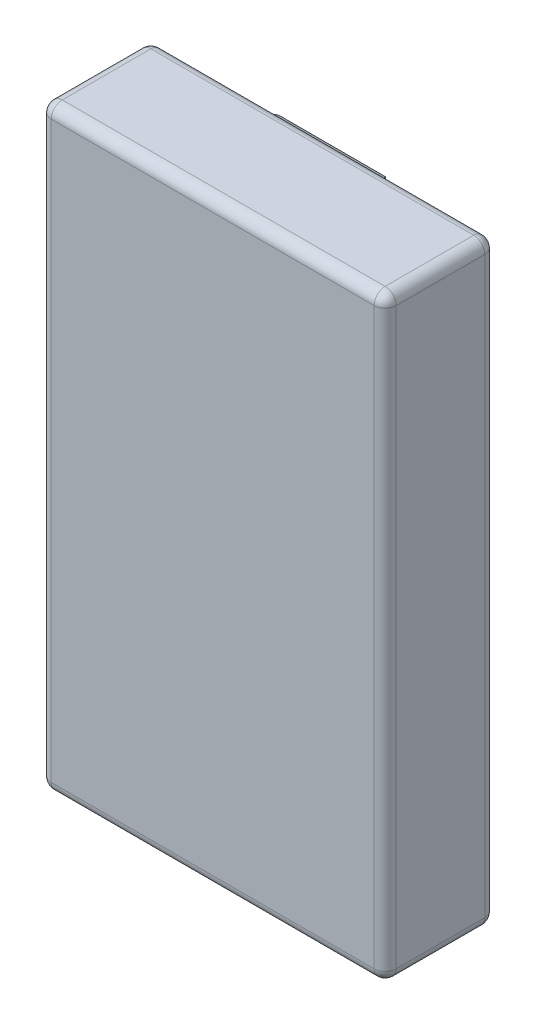
ISO-10303-21;
HEADER;
FILE_DESCRIPTION(('STEP AP214'),'2;1');
FILE_NAME('part.step','',(''),(''),'','','');
FILE_SCHEMA(('AUTOMOTIVE_DESIGN { 1 0 10303 214 1 1 1 1 }'));
ENDSEC;
DATA;
#1=APPLICATION_CONTEXT('core data for automotive mechanical design processes');
#2=APPLICATION_PROTOCOL_DEFINITION('international standard','automotive_design',2000,#1);
#3=PRODUCT_CONTEXT('',#1,'mechanical');
#4=PRODUCT('Part','Part','',(#3));
#5=PRODUCT_RELATED_PRODUCT_CATEGORY('part','',(#4));
#6=PRODUCT_DEFINITION_FORMATION('','',#4);
#7=PRODUCT_DEFINITION_CONTEXT('part definition',#1,'design');
#8=PRODUCT_DEFINITION('design','',#6,#7);
#9=PRODUCT_DEFINITION_SHAPE('','',#8);
#10=(LENGTH_UNIT() NAMED_UNIT(*) SI_UNIT(.MILLI.,.METRE.));
#11=(NAMED_UNIT(*) PLANE_ANGLE_UNIT() SI_UNIT($,.RADIAN.));
#12=(NAMED_UNIT(*) SI_UNIT($,.STERADIAN.) SOLID_ANGLE_UNIT());
#13=UNCERTAINTY_MEASURE_WITH_UNIT(LENGTH_MEASURE(1.E-05),#10,'distance_accuracy_value','');
#14=(GEOMETRIC_REPRESENTATION_CONTEXT(3) GLOBAL_UNCERTAINTY_ASSIGNED_CONTEXT((#13)) GLOBAL_UNIT_ASSIGNED_CONTEXT((#10,
#11,#12)) REPRESENTATION_CONTEXT('',''));
#15=CARTESIAN_POINT('',(0.,0.,0.));
#16=DIRECTION('',(0.,0.,1.));
#17=DIRECTION('',(1.,0.,0.));
#18=AXIS2_PLACEMENT_3D('',#15,#16,#17);
#19=CARTESIAN_POINT('',(15.5863692766047,-16.6557198149287,10.));
#20=DIRECTION('',(-1.,0.,0.));
#21=DIRECTION('',(0.,0.,1.));
#22=AXIS2_PLACEMENT_3D('',#19,#20,#21);
#23=PLANE('',#22);
#24=DIRECTION('',(0.,1.,0.));
#25=VECTOR('',#24,1.);
#26=CARTESIAN_POINT('',(15.5863692766047,-70.5519128041487,9.));
#27=LINE('',#26,#25);
#28=CARTESIAN_POINT('',(15.5863692766047,-17.6557198149287,9.));
#29=VERTEX_POINT('',#28);
#30=CARTESIAN_POINT('',(15.5863692766047,-69.5519128041487,9.));
#31=VERTEX_POINT('',#30);
#32=EDGE_CURVE('E223',#29,#31,#27,.F.);
#33=ORIENTED_EDGE('',*,*,#32,.T.);
#34=DIRECTION('',(0.,0.,-1.));
#35=VECTOR('',#34,1.);
#36=CARTESIAN_POINT('',(15.5863692766047,-69.5519128041487,10.));
#37=LINE('',#36,#35);
#38=CARTESIAN_POINT('',(15.5863692766047,-69.5519128041487,0.999999999999999));
#39=VERTEX_POINT('',#38);
#40=EDGE_CURVE('E225',#31,#39,#37,.T.);
#41=ORIENTED_EDGE('',*,*,#40,.T.);
#42=DIRECTION('',(0.,1.,0.));
#43=VECTOR('',#42,1.);
#44=CARTESIAN_POINT('',(15.5863692766047,-16.6557198149287,0.999999999999999));
#45=LINE('',#44,#43);
#46=CARTESIAN_POINT('',(15.5863692766047,-17.6557198149287,0.999999999999999));
#47=VERTEX_POINT('',#46);
#48=EDGE_CURVE('E213',#39,#47,#45,.T.);
#49=ORIENTED_EDGE('',*,*,#48,.T.);
#50=DIRECTION('',(0.,0.,-1.));
#51=VECTOR('',#50,1.);
#52=CARTESIAN_POINT('',(15.5863692766047,-17.6557198149287,10.));
#53=LINE('',#52,#51);
#54=EDGE_CURVE('E221',#47,#29,#53,.F.);
#55=ORIENTED_EDGE('',*,*,#54,.T.);
#56=EDGE_LOOP('',(#33,#41,#49,#55));
#57=FACE_BOUND('',#56,.T.);
#58=ADVANCED_FACE('F35',(#57),#23,.F.);
#59=CARTESIAN_POINT('',(-15.5863692766047,-16.6557198149287,10.));
#60=DIRECTION('',(0.,-1.,0.));
#61=DIRECTION('',(0.,0.,-1.));
#62=AXIS2_PLACEMENT_3D('',#59,#60,#61);
#63=PLANE('',#62);
#64=DIRECTION('',(-1.,0.,0.));
#65=VECTOR('',#64,1.);
#66=CARTESIAN_POINT('',(15.5863692766047,-16.6557198149287,9.));
#67=LINE('',#66,#65);
#68=CARTESIAN_POINT('',(-14.5863692766047,-16.6557198149287,9.));
#69=VERTEX_POINT('',#68);
#70=CARTESIAN_POINT('',(14.5863692766047,-16.6557198149287,9.));
#71=VERTEX_POINT('',#70);
#72=EDGE_CURVE('E250',#69,#71,#67,.F.);
#73=ORIENTED_EDGE('',*,*,#72,.T.);
#74=DIRECTION('',(0.,0.,-1.));
#75=VECTOR('',#74,1.);
#76=CARTESIAN_POINT('',(14.5863692766047,-16.6557198149287,10.));
#77=LINE('',#76,#75);
#78=CARTESIAN_POINT('',(14.5863692766047,-16.6557198149287,0.999999999999999));
#79=VERTEX_POINT('',#78);
#80=EDGE_CURVE('E252',#71,#79,#77,.T.);
#81=ORIENTED_EDGE('',*,*,#80,.T.);
#82=DIRECTION('',(-1.,0.,0.));
#83=VECTOR('',#82,1.);
#84=CARTESIAN_POINT('',(-15.5863692766047,-16.6557198149287,0.999999999999999));
#85=LINE('',#84,#83);
#86=CARTESIAN_POINT('',(-14.5863692766047,-16.6557198149287,0.999999999999999));
#87=VERTEX_POINT('',#86);
#88=EDGE_CURVE('E248',#79,#87,#85,.T.);
#89=ORIENTED_EDGE('',*,*,#88,.T.);
#90=DIRECTION('',(0.,0.,-1.));
#91=VECTOR('',#90,1.);
#92=CARTESIAN_POINT('',(-14.5863692766047,-16.6557198149287,10.));
#93=LINE('',#92,#91);
#94=EDGE_CURVE('E246',#87,#69,#93,.F.);
#95=ORIENTED_EDGE('',*,*,#94,.T.);
#96=EDGE_LOOP('',(#73,#81,#89,#95));
#97=FACE_BOUND('',#96,.T.);
#98=ADVANCED_FACE('F359',(#97),#63,.F.);
#99=CARTESIAN_POINT('',(-15.5863692766047,-16.6557198149287,10.));
#100=DIRECTION('',(1.,0.,0.));
#101=DIRECTION('',(0.,0.,-1.));
#102=AXIS2_PLACEMENT_3D('',#99,#100,#101);
#103=PLANE('',#102);
#104=DIRECTION('',(0.,0.,-1.));
#105=VECTOR('',#104,1.);
#106=CARTESIAN_POINT('',(-15.5863692766047,-69.5519128041487,10.));
#107=LINE('',#106,#105);
#108=CARTESIAN_POINT('',(-15.5863692766047,-69.5519128041487,0.999999999999999));
#109=VERTEX_POINT('',#108);
#110=CARTESIAN_POINT('',(-15.5863692766047,-69.5519128041487,9.));
#111=VERTEX_POINT('',#110);
#112=EDGE_CURVE('E55',#109,#111,#107,.F.);
#113=ORIENTED_EDGE('',*,*,#112,.T.);
#114=DIRECTION('',(0.,-1.,0.));
#115=VECTOR('',#114,1.);
#116=CARTESIAN_POINT('',(-15.5863692766047,-16.6557198149287,9.));
#117=LINE('',#116,#115);
#118=CARTESIAN_POINT('',(-15.5863692766047,-17.6557198149287,9.));
#119=VERTEX_POINT('',#118);
#120=EDGE_CURVE('E11',#111,#119,#117,.F.);
#121=ORIENTED_EDGE('',*,*,#120,.T.);
#122=DIRECTION('',(0.,0.,-1.));
#123=VECTOR('',#122,1.);
#124=CARTESIAN_POINT('',(-15.5863692766047,-17.6557198149287,10.));
#125=LINE('',#124,#123);
#126=CARTESIAN_POINT('',(-15.5863692766047,-17.6557198149287,0.999999999999999));
#127=VERTEX_POINT('',#126);
#128=EDGE_CURVE('E44',#119,#127,#125,.T.);
#129=ORIENTED_EDGE('',*,*,#128,.T.);
#130=DIRECTION('',(0.,-1.,0.));
#131=VECTOR('',#130,1.);
#132=CARTESIAN_POINT('',(-15.5863692766047,-16.6557198149287,0.999999999999999));
#133=LINE('',#132,#131);
#134=EDGE_CURVE('E264',#127,#109,#133,.T.);
#135=ORIENTED_EDGE('',*,*,#134,.T.);
#136=EDGE_LOOP('',(#113,#121,#129,#135));
#137=FACE_BOUND('',#136,.T.);
#138=ADVANCED_FACE('F373',(#137),#103,.F.);
#139=CARTESIAN_POINT('',(-15.5863692766047,-70.5519128041487,10.));
#140=DIRECTION('',(0.,1.,0.));
#141=DIRECTION('',(0.,0.,1.));
#142=AXIS2_PLACEMENT_3D('',#139,#140,#141);
#143=PLANE('',#142);
#144=DIRECTION('',(1.,0.,0.));
#145=VECTOR('',#144,1.);
#146=CARTESIAN_POINT('',(-15.5863692766047,-70.5519128041487,0.999999999999999));
#147=LINE('',#146,#145);
#148=CARTESIAN_POINT('',(-14.5863692766047,-70.5519128041487,0.999999999999999));
#149=VERTEX_POINT('',#148);
#150=CARTESIAN_POINT('',(14.5863692766047,-70.5519128041487,0.999999999999999));
#151=VERTEX_POINT('',#150);
#152=EDGE_CURVE('E230',#149,#151,#147,.T.);
#153=ORIENTED_EDGE('',*,*,#152,.T.);
#154=DIRECTION('',(0.,0.,-1.));
#155=VECTOR('',#154,1.);
#156=CARTESIAN_POINT('',(14.5863692766047,-70.5519128041487,10.));
#157=LINE('',#156,#155);
#158=CARTESIAN_POINT('',(14.5863692766047,-70.5519128041487,9.));
#159=VERTEX_POINT('',#158);
#160=EDGE_CURVE('E234',#151,#159,#157,.F.);
#161=ORIENTED_EDGE('',*,*,#160,.T.);
#162=DIRECTION('',(1.,0.,0.));
#163=VECTOR('',#162,1.);
#164=CARTESIAN_POINT('',(-15.5863692766047,-70.5519128041487,9.));
#165=LINE('',#164,#163);
#166=CARTESIAN_POINT('',(-14.5863692766047,-70.5519128041487,9.));
#167=VERTEX_POINT('',#166);
#168=EDGE_CURVE('E232',#159,#167,#165,.F.);
#169=ORIENTED_EDGE('',*,*,#168,.T.);
#170=DIRECTION('',(0.,0.,-1.));
#171=VECTOR('',#170,1.);
#172=CARTESIAN_POINT('',(-14.5863692766047,-70.5519128041487,10.));
#173=LINE('',#172,#171);
#174=EDGE_CURVE('E228',#167,#149,#173,.T.);
#175=ORIENTED_EDGE('',*,*,#174,.T.);
#176=EDGE_LOOP('',(#153,#161,#169,#175));
#177=FACE_BOUND('',#176,.T.);
#178=ADVANCED_FACE('F392',(#177),#143,.F.);
#179=CARTESIAN_POINT('',(0.,0.,10.));
#180=DIRECTION('',(0.,0.,1.));
#181=DIRECTION('',(1.,0.,0.));
#182=AXIS2_PLACEMENT_3D('',#179,#180,#181);
#183=PLANE('',#182);
#184=DIRECTION('',(1.,0.,0.));
#185=VECTOR('',#184,1.);
#186=CARTESIAN_POINT('',(15.5863692766047,-69.5519128041487,10.));
#187=LINE('',#186,#185);
#188=CARTESIAN_POINT('',(-14.5863692766047,-69.5519128041487,10.));
#189=VERTEX_POINT('',#188);
#190=CARTESIAN_POINT('',(14.5863692766047,-69.5519128041487,10.));
#191=VERTEX_POINT('',#190);
#192=EDGE_CURVE('E241',#189,#191,#187,.T.);
#193=ORIENTED_EDGE('',*,*,#192,.T.);
#194=DIRECTION('',(0.,1.,0.));
#195=VECTOR('',#194,1.);
#196=CARTESIAN_POINT('',(14.5863692766047,-16.6557198149287,10.));
#197=LINE('',#196,#195);
#198=CARTESIAN_POINT('',(14.5863692766047,-17.6557198149287,10.));
#199=VERTEX_POINT('',#198);
#200=EDGE_CURVE('E243',#191,#199,#197,.T.);
#201=ORIENTED_EDGE('',*,*,#200,.T.);
#202=DIRECTION('',(-1.,0.,0.));
#203=VECTOR('',#202,1.);
#204=CARTESIAN_POINT('',(-15.5863692766047,-17.6557198149287,10.));
#205=LINE('',#204,#203);
#206=CARTESIAN_POINT('',(-14.5863692766047,-17.6557198149287,10.));
#207=VERTEX_POINT('',#206);
#208=EDGE_CURVE('E239',#199,#207,#205,.T.);
#209=ORIENTED_EDGE('',*,*,#208,.T.);
#210=DIRECTION('',(0.,-1.,0.));
#211=VECTOR('',#210,1.);
#212=CARTESIAN_POINT('',(-14.5863692766047,-70.5519128041487,10.));
#213=LINE('',#212,#211);
#214=EDGE_CURVE('E237',#207,#189,#213,.T.);
#215=ORIENTED_EDGE('',*,*,#214,.T.);
#216=EDGE_LOOP('',(#193,#201,#209,#215));
#217=FACE_BOUND('',#216,.T.);
#218=ADVANCED_FACE('F350',(#217),#183,.T.);
#219=CARTESIAN_POINT('',(0.,0.,0.));
#220=DIRECTION('',(0.,0.,1.));
#221=DIRECTION('',(1.,0.,0.));
#222=AXIS2_PLACEMENT_3D('',#219,#220,#221);
#223=PLANE('',#222);
#224=DIRECTION('',(-1.,0.,0.));
#225=VECTOR('',#224,1.);
#226=CARTESIAN_POINT('',(0.,-17.6557198149287,0.));
#227=LINE('',#226,#225);
#228=CARTESIAN_POINT('',(-14.5863692766047,-17.6557198149287,0.));
#229=VERTEX_POINT('',#228);
#230=CARTESIAN_POINT('',(14.5863692766047,-17.6557198149287,0.));
#231=VERTEX_POINT('',#230);
#232=EDGE_CURVE('E257',#229,#231,#227,.F.);
#233=ORIENTED_EDGE('',*,*,#232,.T.);
#234=DIRECTION('',(0.,1.,0.));
#235=VECTOR('',#234,1.);
#236=CARTESIAN_POINT('',(14.5863692766047,0.,0.));
#237=LINE('',#236,#235);
#238=CARTESIAN_POINT('',(14.5863692766047,-69.5519128041487,0.));
#239=VERTEX_POINT('',#238);
#240=EDGE_CURVE('E261',#231,#239,#237,.F.);
#241=ORIENTED_EDGE('',*,*,#240,.T.);
#242=DIRECTION('',(1.,0.,0.));
#243=VECTOR('',#242,1.);
#244=CARTESIAN_POINT('',(0.,-69.5519128041487,0.));
#245=LINE('',#244,#243);
#246=CARTESIAN_POINT('',(-14.5863692766047,-69.5519128041487,0.));
#247=VERTEX_POINT('',#246);
#248=EDGE_CURVE('E259',#239,#247,#245,.F.);
#249=ORIENTED_EDGE('',*,*,#248,.T.);
#250=DIRECTION('',(0.,-1.,0.));
#251=VECTOR('',#250,1.);
#252=CARTESIAN_POINT('',(-14.5863692766047,0.,0.));
#253=LINE('',#252,#251);
#254=EDGE_CURVE('E255',#247,#229,#253,.F.);
#255=ORIENTED_EDGE('',*,*,#254,.T.);
#256=EDGE_LOOP('',(#233,#241,#249,#255));
#257=FACE_BOUND('',#256,.T.);
#258=DIRECTION('',(-1.,0.,0.));
#259=VECTOR('',#258,1.);
#260=CARTESIAN_POINT('',(5.,-17.6789171063672,0.));
#261=LINE('',#260,#259);
#262=CARTESIAN_POINT('',(5.,-17.6789171063672,0.));
#263=VERTEX_POINT('',#262);
#264=CARTESIAN_POINT('',(-5.,-17.6789171063672,0.));
#265=VERTEX_POINT('',#264);
#266=EDGE_CURVE('E171',#263,#265,#261,.T.);
#267=ORIENTED_EDGE('',*,*,#266,.T.);
#268=DIRECTION('',(0.,-1.,0.));
#269=VECTOR('',#268,1.);
#270=CARTESIAN_POINT('',(-5.,-17.6789171063672,0.));
#271=LINE('',#270,#269);
#272=CARTESIAN_POINT('',(-5.,-22.6789171063672,0.));
#273=VERTEX_POINT('',#272);
#274=EDGE_CURVE('E165',#265,#273,#271,.T.);
#275=ORIENTED_EDGE('',*,*,#274,.T.);
#276=DIRECTION('',(1.,0.,0.));
#277=VECTOR('',#276,1.);
#278=CARTESIAN_POINT('',(5.00000000000001,-22.6789171063672,0.));
#279=LINE('',#278,#277);
#280=CARTESIAN_POINT('',(5.00000000000001,-22.6789171063672,0.));
#281=VERTEX_POINT('',#280);
#282=EDGE_CURVE('E174',#273,#281,#279,.T.);
#283=ORIENTED_EDGE('',*,*,#282,.T.);
#284=DIRECTION('',(0.,1.,0.));
#285=VECTOR('',#284,1.);
#286=CARTESIAN_POINT('',(5.,-17.6789171063672,0.));
#287=LINE('',#286,#285);
#288=EDGE_CURVE('E180',#281,#263,#287,.T.);
#289=ORIENTED_EDGE('',*,*,#288,.T.);
#290=EDGE_LOOP('',(#267,#275,#283,#289));
#291=FACE_BOUND('',#290,.T.);
#292=ADVANCED_FACE('F182',(#257,#291),#223,.F.);
#293=CARTESIAN_POINT('',(-5.,-17.6789171063672,-1.2));
#294=DIRECTION('',(-1.,0.,0.));
#295=DIRECTION('',(0.,0.,1.));
#296=AXIS2_PLACEMENT_3D('',#293,#294,#295);
#297=PLANE('',#296);
#298=DIRECTION('',(0.,0.,1.));
#299=VECTOR('',#298,1.);
#300=CARTESIAN_POINT('',(-5.,-17.6789171063672,-1.2));
#301=LINE('',#300,#299);
#302=CARTESIAN_POINT('',(-5.,-17.6789171063672,-0.2));
#303=VERTEX_POINT('',#302);
#304=EDGE_CURVE('E192',#303,#265,#301,.T.);
#305=ORIENTED_EDGE('',*,*,#304,.F.);
#306=DIRECTION('',(0.,-1.,0.));
#307=VECTOR('',#306,1.);
#308=CARTESIAN_POINT('',(-5.,-17.6789171063672,-0.2));
#309=LINE('',#308,#307);
#310=CARTESIAN_POINT('',(-5.,-22.6789171063672,-0.2));
#311=VERTEX_POINT('',#310);
#312=EDGE_CURVE('E168',#303,#311,#309,.T.);
#313=ORIENTED_EDGE('',*,*,#312,.T.);
#314=DIRECTION('',(0.,0.,1.));
#315=VECTOR('',#314,1.);
#316=CARTESIAN_POINT('',(-5.,-22.6789171063672,-1.2));
#317=LINE('',#316,#315);
#318=EDGE_CURVE('E160',#311,#273,#317,.T.);
#319=ORIENTED_EDGE('',*,*,#318,.T.);
#320=ORIENTED_EDGE('',*,*,#274,.F.);
#321=EDGE_LOOP('',(#305,#313,#319,#320));
#322=FACE_BOUND('',#321,.T.);
#323=ADVANCED_FACE('F163',(#322),#297,.T.);
#324=CARTESIAN_POINT('',(5.,-17.6789171063672,-1.2));
#325=DIRECTION('',(0.,1.,0.));
#326=DIRECTION('',(-1.,0.,0.));
#327=AXIS2_PLACEMENT_3D('',#324,#325,#326);
#328=PLANE('',#327);
#329=DIRECTION('',(0.,0.,1.));
#330=VECTOR('',#329,1.);
#331=CARTESIAN_POINT('',(5.,-17.6789171063672,-1.2));
#332=LINE('',#331,#330);
#333=CARTESIAN_POINT('',(5.,-17.6789171063672,-0.2));
#334=VERTEX_POINT('',#333);
#335=EDGE_CURVE('E194',#334,#263,#332,.T.);
#336=ORIENTED_EDGE('',*,*,#335,.F.);
#337=DIRECTION('',(-1.,0.,0.));
#338=VECTOR('',#337,1.);
#339=CARTESIAN_POINT('',(5.,-17.6789171063672,-0.2));
#340=LINE('',#339,#338);
#341=EDGE_CURVE('E209',#334,#303,#340,.T.);
#342=ORIENTED_EDGE('',*,*,#341,.T.);
#343=ORIENTED_EDGE('',*,*,#304,.T.);
#344=ORIENTED_EDGE('',*,*,#266,.F.);
#345=EDGE_LOOP('',(#336,#342,#343,#344));
#346=FACE_BOUND('',#345,.T.);
#347=ADVANCED_FACE('F732',(#346),#328,.T.);
#348=CARTESIAN_POINT('',(5.,-17.6789171063672,-1.2));
#349=DIRECTION('',(1.,0.,0.));
#350=DIRECTION('',(0.,1.,0.));
#351=AXIS2_PLACEMENT_3D('',#348,#349,#350);
#352=PLANE('',#351);
#353=DIRECTION('',(0.,0.,1.));
#354=VECTOR('',#353,1.);
#355=CARTESIAN_POINT('',(5.00000000000001,-22.6789171063672,-1.2));
#356=LINE('',#355,#354);
#357=CARTESIAN_POINT('',(5.00000000000001,-22.6789171063672,-0.2));
#358=VERTEX_POINT('',#357);
#359=EDGE_CURVE('E170',#358,#281,#356,.T.);
#360=ORIENTED_EDGE('',*,*,#359,.F.);
#361=DIRECTION('',(0.,1.,0.));
#362=VECTOR('',#361,1.);
#363=CARTESIAN_POINT('',(5.,-17.6789171063672,-0.2));
#364=LINE('',#363,#362);
#365=EDGE_CURVE('E207',#358,#334,#364,.T.);
#366=ORIENTED_EDGE('',*,*,#365,.T.);
#367=ORIENTED_EDGE('',*,*,#335,.T.);
#368=ORIENTED_EDGE('',*,*,#288,.F.);
#369=EDGE_LOOP('',(#360,#366,#367,#368));
#370=FACE_BOUND('',#369,.T.);
#371=ADVANCED_FACE('F723',(#370),#352,.T.);
#372=CARTESIAN_POINT('',(5.00000000000001,-22.6789171063672,-1.2));
#373=DIRECTION('',(0.,-1.,0.));
#374=DIRECTION('',(1.,0.,0.));
#375=AXIS2_PLACEMENT_3D('',#372,#373,#374);
#376=PLANE('',#375);
#377=ORIENTED_EDGE('',*,*,#318,.F.);
#378=DIRECTION('',(1.,0.,0.));
#379=VECTOR('',#378,1.);
#380=CARTESIAN_POINT('',(5.00000000000001,-22.6789171063672,-0.2));
#381=LINE('',#380,#379);
#382=EDGE_CURVE('E211',#311,#358,#381,.T.);
#383=ORIENTED_EDGE('',*,*,#382,.T.);
#384=ORIENTED_EDGE('',*,*,#359,.T.);
#385=ORIENTED_EDGE('',*,*,#282,.F.);
#386=EDGE_LOOP('',(#377,#383,#384,#385));
#387=FACE_BOUND('',#386,.T.);
#388=ADVANCED_FACE('F175',(#387),#376,.T.);
#389=CARTESIAN_POINT('',(0.,0.,-1.2));
#390=DIRECTION('',(0.,0.,-1.));
#391=DIRECTION('',(-1.,0.,0.));
#392=AXIS2_PLACEMENT_3D('',#389,#390,#391);
#393=PLANE('',#392);
#394=DIRECTION('',(0.,-1.,0.));
#395=VECTOR('',#394,1.);
#396=CARTESIAN_POINT('',(-4.,0.,-1.2));
#397=LINE('',#396,#395);
#398=CARTESIAN_POINT('',(-4.,-21.6789171063672,-1.2));
#399=VERTEX_POINT('',#398);
#400=CARTESIAN_POINT('',(-4.,-18.6789171063672,-1.2));
#401=VERTEX_POINT('',#400);
#402=EDGE_CURVE('E202',#399,#401,#397,.F.);
#403=ORIENTED_EDGE('',*,*,#402,.T.);
#404=DIRECTION('',(-1.,0.,0.));
#405=VECTOR('',#404,1.);
#406=CARTESIAN_POINT('',(0.,-18.6789171063672,-1.2));
#407=LINE('',#406,#405);
#408=CARTESIAN_POINT('',(4.,-18.6789171063672,-1.2));
#409=VERTEX_POINT('',#408);
#410=EDGE_CURVE('E205',#401,#409,#407,.F.);
#411=ORIENTED_EDGE('',*,*,#410,.T.);
#412=DIRECTION('',(0.,1.,0.));
#413=VECTOR('',#412,1.);
#414=CARTESIAN_POINT('',(4.,0.,-1.2));
#415=LINE('',#414,#413);
#416=CARTESIAN_POINT('',(4.00000000000001,-21.6789171063672,-1.2));
#417=VERTEX_POINT('',#416);
#418=EDGE_CURVE('E200',#409,#417,#415,.F.);
#419=ORIENTED_EDGE('',*,*,#418,.T.);
#420=DIRECTION('',(1.,0.,0.));
#421=VECTOR('',#420,1.);
#422=CARTESIAN_POINT('',(0.,-21.6789171063672,-1.2));
#423=LINE('',#422,#421);
#424=EDGE_CURVE('E198',#417,#399,#423,.F.);
#425=ORIENTED_EDGE('',*,*,#424,.T.);
#426=EDGE_LOOP('',(#403,#411,#419,#425));
#427=FACE_BOUND('',#426,.T.);
#428=ADVANCED_FACE('F442',(#427),#393,.T.);
#429=CARTESIAN_POINT('',(4.,-17.6789171063672,-0.2));
#430=DIRECTION('',(0.,1.,0.));
#431=DIRECTION('',(-1.,0.,0.));
#432=AXIS2_PLACEMENT_3D('',#429,#430,#431);
#433=CYLINDRICAL_SURFACE('',#432,1.);
#434=CARTESIAN_POINT('',(4.00000000000001,-21.6789171063672,-0.2));
#435=DIRECTION('',(0.707106781186547,0.707106781186548,0.));
#436=DIRECTION('',(0.707106781186548,-0.707106781186547,0.));
#437=AXIS2_PLACEMENT_3D('',#434,#435,#436);
#438=ELLIPSE('',#437,1.41421356237309,1.);
#439=EDGE_CURVE('E187',#417,#358,#438,.F.);
#440=ORIENTED_EDGE('',*,*,#439,.F.);
#441=ORIENTED_EDGE('',*,*,#418,.F.);
#442=CARTESIAN_POINT('',(4.,-18.6789171063672,-0.2));
#443=DIRECTION('',(-0.707106781186548,0.707106781186547,0.));
#444=DIRECTION('',(-0.707106781186547,-0.707106781186548,0.));
#445=AXIS2_PLACEMENT_3D('',#442,#443,#444);
#446=ELLIPSE('',#445,1.4142135623731,1.);
#447=EDGE_CURVE('E184',#334,#409,#446,.T.);
#448=ORIENTED_EDGE('',*,*,#447,.F.);
#449=ORIENTED_EDGE('',*,*,#365,.F.);
#450=EDGE_LOOP('',(#440,#441,#448,#449));
#451=FACE_BOUND('',#450,.T.);
#452=ADVANCED_FACE('F438',(#451),#433,.T.);
#453=CARTESIAN_POINT('',(5.,-18.6789171063672,-0.2));
#454=DIRECTION('',(-1.,0.,0.));
#455=DIRECTION('',(0.,-1.,0.));
#456=AXIS2_PLACEMENT_3D('',#453,#454,#455);
#457=CYLINDRICAL_SURFACE('',#456,1.);
#458=ORIENTED_EDGE('',*,*,#447,.T.);
#459=ORIENTED_EDGE('',*,*,#410,.F.);
#460=CARTESIAN_POINT('',(-4.,-18.6789171063672,-0.2));
#461=DIRECTION('',(-0.707106781186547,-0.707106781186548,0.));
#462=DIRECTION('',(-0.707106781186548,0.707106781186547,0.));
#463=AXIS2_PLACEMENT_3D('',#460,#461,#462);
#464=ELLIPSE('',#463,1.41421356237309,1.);
#465=EDGE_CURVE('E216',#303,#401,#464,.T.);
#466=ORIENTED_EDGE('',*,*,#465,.F.);
#467=ORIENTED_EDGE('',*,*,#341,.F.);
#468=EDGE_LOOP('',(#458,#459,#466,#467));
#469=FACE_BOUND('',#468,.T.);
#470=ADVANCED_FACE('F434',(#469),#457,.T.);
#471=CARTESIAN_POINT('',(5.00000000000001,-21.6789171063672,-0.2));
#472=DIRECTION('',(1.,0.,0.));
#473=DIRECTION('',(0.,1.,0.));
#474=AXIS2_PLACEMENT_3D('',#471,#472,#473);
#475=CYLINDRICAL_SURFACE('',#474,1.);
#476=ORIENTED_EDGE('',*,*,#439,.T.);
#477=ORIENTED_EDGE('',*,*,#382,.F.);
#478=CARTESIAN_POINT('',(-4.,-21.6789171063672,-0.2));
#479=DIRECTION('',(0.707106781186548,-0.707106781186547,0.));
#480=DIRECTION('',(0.707106781186547,0.707106781186548,0.));
#481=AXIS2_PLACEMENT_3D('',#478,#479,#480);
#482=ELLIPSE('',#481,1.4142135623731,1.);
#483=EDGE_CURVE('E214',#399,#311,#482,.F.);
#484=ORIENTED_EDGE('',*,*,#483,.F.);
#485=ORIENTED_EDGE('',*,*,#424,.F.);
#486=EDGE_LOOP('',(#476,#477,#484,#485));
#487=FACE_BOUND('',#486,.T.);
#488=ADVANCED_FACE('F430',(#487),#475,.T.);
#489=CARTESIAN_POINT('',(-4.,-17.6789171063672,-0.2));
#490=DIRECTION('',(0.,-1.,0.));
#491=DIRECTION('',(0.,0.,-1.));
#492=AXIS2_PLACEMENT_3D('',#489,#490,#491);
#493=CYLINDRICAL_SURFACE('',#492,1.);
#494=ORIENTED_EDGE('',*,*,#465,.T.);
#495=ORIENTED_EDGE('',*,*,#402,.F.);
#496=ORIENTED_EDGE('',*,*,#483,.T.);
#497=ORIENTED_EDGE('',*,*,#312,.F.);
#498=EDGE_LOOP('',(#494,#495,#496,#497));
#499=FACE_BOUND('',#498,.T.);
#500=ADVANCED_FACE('F427',(#499),#493,.T.);
#501=CARTESIAN_POINT('',(-14.5863692766047,-17.6557198149287,10.));
#502=DIRECTION('',(0.,0.,-1.));
#503=DIRECTION('',(-1.,0.,0.));
#504=AXIS2_PLACEMENT_3D('',#501,#502,#503);
#505=CYLINDRICAL_SURFACE('',#504,1.);
#506=CARTESIAN_POINT('',(-14.5863692766047,-17.6557198149287,9.));
#507=DIRECTION('',(0.,0.,1.));
#508=DIRECTION('',(1.,0.,0.));
#509=AXIS2_PLACEMENT_3D('',#506,#507,#508);
#510=CIRCLE('',#509,1.);
#511=EDGE_CURVE('E39',#69,#119,#510,.T.);
#512=ORIENTED_EDGE('',*,*,#511,.F.);
#513=ORIENTED_EDGE('',*,*,#94,.F.);
#514=CARTESIAN_POINT('',(-14.5863692766047,-17.6557198149287,0.999999999999999));
#515=DIRECTION('',(0.,0.,-1.));
#516=DIRECTION('',(-1.,0.,0.));
#517=AXIS2_PLACEMENT_3D('',#514,#515,#516);
#518=CIRCLE('',#517,1.);
#519=EDGE_CURVE('E328',#127,#87,#518,.T.);
#520=ORIENTED_EDGE('',*,*,#519,.F.);
#521=ORIENTED_EDGE('',*,*,#128,.F.);
#522=EDGE_LOOP('',(#512,#513,#520,#521));
#523=FACE_BOUND('',#522,.T.);
#524=ADVANCED_FACE('F37',(#523),#505,.T.);
#525=CARTESIAN_POINT('',(-14.5863692766047,-17.6557198149287,9.));
#526=DIRECTION('',(0.,0.,1.));
#527=DIRECTION('',(1.,0.,0.));
#528=AXIS2_PLACEMENT_3D('',#525,#526,#527);
#529=SPHERICAL_SURFACE('',#528,1.);
#530=CARTESIAN_POINT('',(-14.5863692766047,-17.6557198149287,9.));
#531=DIRECTION('',(-1.,0.,0.));
#532=DIRECTION('',(0.,0.,1.));
#533=AXIS2_PLACEMENT_3D('',#530,#531,#532);
#534=CIRCLE('',#533,1.);
#535=EDGE_CURVE('E323',#69,#207,#534,.F.);
#536=ORIENTED_EDGE('',*,*,#535,.F.);
#537=ORIENTED_EDGE('',*,*,#511,.T.);
#538=CARTESIAN_POINT('',(-14.5863692766047,-17.6557198149287,9.));
#539=DIRECTION('',(0.,1.,0.));
#540=DIRECTION('',(0.,0.,1.));
#541=AXIS2_PLACEMENT_3D('',#538,#539,#540);
#542=CIRCLE('',#541,1.);
#543=EDGE_CURVE('E326',#207,#119,#542,.F.);
#544=ORIENTED_EDGE('',*,*,#543,.F.);
#545=EDGE_LOOP('',(#536,#537,#544));
#546=FACE_BOUND('',#545,.T.);
#547=ADVANCED_FACE('F339',(#546),#529,.T.);
#548=CARTESIAN_POINT('',(-14.5863692766047,-17.6557198149287,1.));
#549=DIRECTION('',(0.,0.,1.));
#550=DIRECTION('',(1.,0.,0.));
#551=AXIS2_PLACEMENT_3D('',#548,#549,#550);
#552=SPHERICAL_SURFACE('',#551,1.);
#553=CARTESIAN_POINT('',(-14.5863692766047,-17.6557198149287,1.));
#554=DIRECTION('',(0.,1.,0.));
#555=DIRECTION('',(0.,0.,1.));
#556=AXIS2_PLACEMENT_3D('',#553,#554,#555);
#557=CIRCLE('',#556,1.);
#558=EDGE_CURVE('E317',#127,#229,#557,.F.);
#559=ORIENTED_EDGE('',*,*,#558,.F.);
#560=ORIENTED_EDGE('',*,*,#519,.T.);
#561=CARTESIAN_POINT('',(-14.5863692766047,-17.6557198149287,0.999999999999999));
#562=DIRECTION('',(-1.,0.,0.));
#563=DIRECTION('',(0.,0.,1.));
#564=AXIS2_PLACEMENT_3D('',#561,#562,#563);
#565=CIRCLE('',#564,1.);
#566=EDGE_CURVE('E320',#229,#87,#565,.F.);
#567=ORIENTED_EDGE('',*,*,#566,.F.);
#568=EDGE_LOOP('',(#559,#560,#567));
#569=FACE_BOUND('',#568,.T.);
#570=ADVANCED_FACE('F603',(#569),#552,.T.);
#571=CARTESIAN_POINT('',(-14.5863692766047,0.,9.));
#572=DIRECTION('',(0.,1.,0.));
#573=DIRECTION('',(0.,0.,1.));
#574=AXIS2_PLACEMENT_3D('',#571,#572,#573);
#575=CYLINDRICAL_SURFACE('',#574,1.);
#576=ORIENTED_EDGE('',*,*,#543,.T.);
#577=ORIENTED_EDGE('',*,*,#120,.F.);
#578=CARTESIAN_POINT('',(-14.5863692766047,-69.5519128041487,9.));
#579=DIRECTION('',(0.,-1.,0.));
#580=DIRECTION('',(0.,0.,-1.));
#581=AXIS2_PLACEMENT_3D('',#578,#579,#580);
#582=CIRCLE('',#581,1.);
#583=EDGE_CURVE('E311',#189,#111,#582,.T.);
#584=ORIENTED_EDGE('',*,*,#583,.F.);
#585=ORIENTED_EDGE('',*,*,#214,.F.);
#586=EDGE_LOOP('',(#576,#577,#584,#585));
#587=FACE_BOUND('',#586,.T.);
#588=ADVANCED_FACE('F345',(#587),#575,.T.);
#589=CARTESIAN_POINT('',(0.,-17.6557198149287,9.));
#590=DIRECTION('',(1.,0.,0.));
#591=DIRECTION('',(0.,0.,-1.));
#592=AXIS2_PLACEMENT_3D('',#589,#590,#591);
#593=CYLINDRICAL_SURFACE('',#592,1.);
#594=ORIENTED_EDGE('',*,*,#535,.T.);
#595=ORIENTED_EDGE('',*,*,#208,.F.);
#596=CARTESIAN_POINT('',(14.5863692766047,-17.6557198149287,9.));
#597=DIRECTION('',(1.,0.,0.));
#598=DIRECTION('',(0.,0.,-1.));
#599=AXIS2_PLACEMENT_3D('',#596,#597,#598);
#600=CIRCLE('',#599,1.);
#601=EDGE_CURVE('E308',#71,#199,#600,.T.);
#602=ORIENTED_EDGE('',*,*,#601,.F.);
#603=ORIENTED_EDGE('',*,*,#72,.F.);
#604=EDGE_LOOP('',(#594,#595,#602,#603));
#605=FACE_BOUND('',#604,.T.);
#606=ADVANCED_FACE('F356',(#605),#593,.T.);
#607=CARTESIAN_POINT('',(14.5863692766047,-17.6557198149287,10.));
#608=DIRECTION('',(0.,0.,-1.));
#609=DIRECTION('',(-1.,0.,0.));
#610=AXIS2_PLACEMENT_3D('',#607,#608,#609);
#611=CYLINDRICAL_SURFACE('',#610,1.);
#612=CARTESIAN_POINT('',(14.5863692766047,-17.6557198149287,0.999999999999999));
#613=DIRECTION('',(0.,0.,-1.));
#614=DIRECTION('',(-1.,0.,0.));
#615=AXIS2_PLACEMENT_3D('',#612,#613,#614);
#616=CIRCLE('',#615,1.);
#617=EDGE_CURVE('E302',#79,#47,#616,.T.);
#618=ORIENTED_EDGE('',*,*,#617,.F.);
#619=ORIENTED_EDGE('',*,*,#80,.F.);
#620=CARTESIAN_POINT('',(14.5863692766047,-17.6557198149287,9.));
#621=DIRECTION('',(0.,0.,1.));
#622=DIRECTION('',(1.,0.,0.));
#623=AXIS2_PLACEMENT_3D('',#620,#621,#622);
#624=CIRCLE('',#623,1.);
#625=EDGE_CURVE('E305',#29,#71,#624,.T.);
#626=ORIENTED_EDGE('',*,*,#625,.F.);
#627=ORIENTED_EDGE('',*,*,#54,.F.);
#628=EDGE_LOOP('',(#618,#619,#626,#627));
#629=FACE_BOUND('',#628,.T.);
#630=ADVANCED_FACE('F363',(#629),#611,.T.);
#631=CARTESIAN_POINT('',(-15.5863692766047,-17.6557198149287,0.999999999999999));
#632=DIRECTION('',(-1.,0.,0.));
#633=DIRECTION('',(0.,0.,1.));
#634=AXIS2_PLACEMENT_3D('',#631,#632,#633);
#635=CYLINDRICAL_SURFACE('',#634,1.);
#636=ORIENTED_EDGE('',*,*,#566,.T.);
#637=ORIENTED_EDGE('',*,*,#88,.F.);
#638=CARTESIAN_POINT('',(14.5863692766047,-17.6557198149287,1.));
#639=DIRECTION('',(1.,0.,0.));
#640=DIRECTION('',(0.,0.,-1.));
#641=AXIS2_PLACEMENT_3D('',#638,#639,#640);
#642=CIRCLE('',#641,1.);
#643=EDGE_CURVE('E300',#231,#79,#642,.T.);
#644=ORIENTED_EDGE('',*,*,#643,.F.);
#645=ORIENTED_EDGE('',*,*,#232,.F.);
#646=EDGE_LOOP('',(#636,#637,#644,#645));
#647=FACE_BOUND('',#646,.T.);
#648=ADVANCED_FACE('F371',(#647),#635,.T.);
#649=CARTESIAN_POINT('',(-14.5863692766047,-16.6557198149287,0.999999999999999));
#650=DIRECTION('',(0.,-1.,0.));
#651=DIRECTION('',(0.,0.,-1.));
#652=AXIS2_PLACEMENT_3D('',#649,#650,#651);
#653=CYLINDRICAL_SURFACE('',#652,1.);
#654=ORIENTED_EDGE('',*,*,#558,.T.);
#655=ORIENTED_EDGE('',*,*,#254,.F.);
#656=CARTESIAN_POINT('',(-14.5863692766047,-69.5519128041487,0.999999999999999));
#657=DIRECTION('',(0.,-1.,0.));
#658=DIRECTION('',(0.,0.,-1.));
#659=AXIS2_PLACEMENT_3D('',#656,#657,#658);
#660=CIRCLE('',#659,1.);
#661=EDGE_CURVE('E297',#109,#247,#660,.T.);
#662=ORIENTED_EDGE('',*,*,#661,.F.);
#663=ORIENTED_EDGE('',*,*,#134,.F.);
#664=EDGE_LOOP('',(#654,#655,#662,#663));
#665=FACE_BOUND('',#664,.T.);
#666=ADVANCED_FACE('F382',(#665),#653,.T.);
#667=CARTESIAN_POINT('',(-14.5863692766047,-69.5519128041487,10.));
#668=DIRECTION('',(0.,0.,-1.));
#669=DIRECTION('',(-1.,0.,0.));
#670=AXIS2_PLACEMENT_3D('',#667,#668,#669);
#671=CYLINDRICAL_SURFACE('',#670,1.);
#672=CARTESIAN_POINT('',(-14.5863692766047,-69.5519128041487,9.));
#673=DIRECTION('',(0.,0.,1.));
#674=DIRECTION('',(1.,0.,0.));
#675=AXIS2_PLACEMENT_3D('',#672,#673,#674);
#676=CIRCLE('',#675,1.);
#677=EDGE_CURVE('E314',#111,#167,#676,.T.);
#678=ORIENTED_EDGE('',*,*,#677,.F.);
#679=ORIENTED_EDGE('',*,*,#112,.F.);
#680=CARTESIAN_POINT('',(-14.5863692766047,-69.5519128041487,0.999999999999999));
#681=DIRECTION('',(0.,0.,-1.));
#682=DIRECTION('',(-1.,0.,0.));
#683=AXIS2_PLACEMENT_3D('',#680,#681,#682);
#684=CIRCLE('',#683,1.);
#685=EDGE_CURVE('E294',#149,#109,#684,.T.);
#686=ORIENTED_EDGE('',*,*,#685,.F.);
#687=ORIENTED_EDGE('',*,*,#174,.F.);
#688=EDGE_LOOP('',(#678,#679,#686,#687));
#689=FACE_BOUND('',#688,.T.);
#690=ADVANCED_FACE('F378',(#689),#671,.T.);
#691=CARTESIAN_POINT('',(-14.5863692766047,-69.5519128041487,9.));
#692=DIRECTION('',(0.,0.,1.));
#693=DIRECTION('',(1.,0.,0.));
#694=AXIS2_PLACEMENT_3D('',#691,#692,#693);
#695=SPHERICAL_SURFACE('',#694,1.);
#696=ORIENTED_EDGE('',*,*,#583,.T.);
#697=ORIENTED_EDGE('',*,*,#677,.T.);
#698=CARTESIAN_POINT('',(-14.5863692766047,-69.5519128041487,9.));
#699=DIRECTION('',(-1.,0.,0.));
#700=DIRECTION('',(0.,0.,1.));
#701=AXIS2_PLACEMENT_3D('',#698,#699,#700);
#702=CIRCLE('',#701,1.);
#703=EDGE_CURVE('E291',#189,#167,#702,.F.);
#704=ORIENTED_EDGE('',*,*,#703,.F.);
#705=EDGE_LOOP('',(#696,#697,#704));
#706=FACE_BOUND('',#705,.T.);
#707=ADVANCED_FACE('F395',(#706),#695,.T.);
#708=CARTESIAN_POINT('',(14.5863692766047,-17.6557198149287,9.));
#709=DIRECTION('',(0.,0.,1.));
#710=DIRECTION('',(1.,0.,0.));
#711=AXIS2_PLACEMENT_3D('',#708,#709,#710);
#712=SPHERICAL_SURFACE('',#711,1.);
#713=ORIENTED_EDGE('',*,*,#625,.T.);
#714=ORIENTED_EDGE('',*,*,#601,.T.);
#715=CARTESIAN_POINT('',(14.5863692766047,-17.6557198149287,9.));
#716=DIRECTION('',(0.,1.,0.));
#717=DIRECTION('',(0.,0.,1.));
#718=AXIS2_PLACEMENT_3D('',#715,#716,#717);
#719=CIRCLE('',#718,1.);
#720=EDGE_CURVE('E289',#29,#199,#719,.F.);
#721=ORIENTED_EDGE('',*,*,#720,.F.);
#722=EDGE_LOOP('',(#713,#714,#721));
#723=FACE_BOUND('',#722,.T.);
#724=ADVANCED_FACE('F408',(#723),#712,.T.);
#725=CARTESIAN_POINT('',(14.5863692766047,-17.6557198149287,1.));
#726=DIRECTION('',(0.,0.,1.));
#727=DIRECTION('',(1.,0.,0.));
#728=AXIS2_PLACEMENT_3D('',#725,#726,#727);
#729=SPHERICAL_SURFACE('',#728,1.);
#730=ORIENTED_EDGE('',*,*,#643,.T.);
#731=ORIENTED_EDGE('',*,*,#617,.T.);
#732=CARTESIAN_POINT('',(14.5863692766047,-17.6557198149287,0.999999999999999));
#733=DIRECTION('',(0.,1.,0.));
#734=DIRECTION('',(0.,0.,1.));
#735=AXIS2_PLACEMENT_3D('',#732,#733,#734);
#736=CIRCLE('',#735,1.);
#737=EDGE_CURVE('E286',#231,#47,#736,.F.);
#738=ORIENTED_EDGE('',*,*,#737,.F.);
#739=EDGE_LOOP('',(#730,#731,#738));
#740=FACE_BOUND('',#739,.T.);
#741=ADVANCED_FACE('F410',(#740),#729,.T.);
#742=CARTESIAN_POINT('',(-14.5863692766047,-69.5519128041487,1.));
#743=DIRECTION('',(0.,0.,1.));
#744=DIRECTION('',(1.,0.,0.));
#745=AXIS2_PLACEMENT_3D('',#742,#743,#744);
#746=SPHERICAL_SURFACE('',#745,1.);
#747=ORIENTED_EDGE('',*,*,#685,.T.);
#748=ORIENTED_EDGE('',*,*,#661,.T.);
#749=CARTESIAN_POINT('',(-14.5863692766047,-69.5519128041487,1.));
#750=DIRECTION('',(-1.,0.,0.));
#751=DIRECTION('',(0.,0.,1.));
#752=AXIS2_PLACEMENT_3D('',#749,#750,#751);
#753=CIRCLE('',#752,1.);
#754=EDGE_CURVE('E283',#149,#247,#753,.F.);
#755=ORIENTED_EDGE('',*,*,#754,.F.);
#756=EDGE_LOOP('',(#747,#748,#755));
#757=FACE_BOUND('',#756,.T.);
#758=ADVANCED_FACE('F384',(#757),#746,.T.);
#759=CARTESIAN_POINT('',(0.,-69.5519128041487,9.));
#760=DIRECTION('',(-1.,0.,0.));
#761=DIRECTION('',(0.,0.,1.));
#762=AXIS2_PLACEMENT_3D('',#759,#760,#761);
#763=CYLINDRICAL_SURFACE('',#762,1.);
#764=ORIENTED_EDGE('',*,*,#703,.T.);
#765=ORIENTED_EDGE('',*,*,#168,.F.);
#766=CARTESIAN_POINT('',(14.5863692766047,-69.5519128041487,9.));
#767=DIRECTION('',(1.,0.,0.));
#768=DIRECTION('',(0.,0.,-1.));
#769=AXIS2_PLACEMENT_3D('',#766,#767,#768);
#770=CIRCLE('',#769,1.);
#771=EDGE_CURVE('E280',#191,#159,#770,.T.);
#772=ORIENTED_EDGE('',*,*,#771,.F.);
#773=ORIENTED_EDGE('',*,*,#192,.F.);
#774=EDGE_LOOP('',(#764,#765,#772,#773));
#775=FACE_BOUND('',#774,.T.);
#776=ADVANCED_FACE('F397',(#775),#763,.T.);
#777=CARTESIAN_POINT('',(14.5863692766047,0.,9.));
#778=DIRECTION('',(0.,-1.,0.));
#779=DIRECTION('',(0.,0.,-1.));
#780=AXIS2_PLACEMENT_3D('',#777,#778,#779);
#781=CYLINDRICAL_SURFACE('',#780,1.);
#782=ORIENTED_EDGE('',*,*,#720,.T.);
#783=ORIENTED_EDGE('',*,*,#200,.F.);
#784=CARTESIAN_POINT('',(14.5863692766047,-69.5519128041487,9.));
#785=DIRECTION('',(0.,-1.,0.));
#786=DIRECTION('',(0.,0.,-1.));
#787=AXIS2_PLACEMENT_3D('',#784,#785,#786);
#788=CIRCLE('',#787,1.);
#789=EDGE_CURVE('E277',#31,#191,#788,.T.);
#790=ORIENTED_EDGE('',*,*,#789,.F.);
#791=ORIENTED_EDGE('',*,*,#32,.F.);
#792=EDGE_LOOP('',(#782,#783,#790,#791));
#793=FACE_BOUND('',#792,.T.);
#794=ADVANCED_FACE('F406',(#793),#781,.T.);
#795=CARTESIAN_POINT('',(14.5863692766047,-16.6557198149287,0.999999999999999));
#796=DIRECTION('',(0.,1.,0.));
#797=DIRECTION('',(0.,0.,1.));
#798=AXIS2_PLACEMENT_3D('',#795,#796,#797);
#799=CYLINDRICAL_SURFACE('',#798,1.);
#800=ORIENTED_EDGE('',*,*,#737,.T.);
#801=ORIENTED_EDGE('',*,*,#48,.F.);
#802=CARTESIAN_POINT('',(14.5863692766047,-69.5519128041487,1.));
#803=DIRECTION('',(0.,-1.,0.));
#804=DIRECTION('',(0.,0.,-1.));
#805=AXIS2_PLACEMENT_3D('',#802,#803,#804);
#806=CIRCLE('',#805,1.);
#807=EDGE_CURVE('E274',#239,#39,#806,.T.);
#808=ORIENTED_EDGE('',*,*,#807,.F.);
#809=ORIENTED_EDGE('',*,*,#240,.F.);
#810=EDGE_LOOP('',(#800,#801,#808,#809));
#811=FACE_BOUND('',#810,.T.);
#812=ADVANCED_FACE('F456',(#811),#799,.T.);
#813=CARTESIAN_POINT('',(-15.5863692766047,-69.5519128041487,0.999999999999999));
#814=DIRECTION('',(1.,0.,0.));
#815=DIRECTION('',(0.,0.,-1.));
#816=AXIS2_PLACEMENT_3D('',#813,#814,#815);
#817=CYLINDRICAL_SURFACE('',#816,1.);
#818=ORIENTED_EDGE('',*,*,#754,.T.);
#819=ORIENTED_EDGE('',*,*,#248,.F.);
#820=CARTESIAN_POINT('',(14.5863692766047,-69.5519128041487,0.999999999999999));
#821=DIRECTION('',(1.,0.,0.));
#822=DIRECTION('',(0.,0.,-1.));
#823=AXIS2_PLACEMENT_3D('',#820,#821,#822);
#824=CIRCLE('',#823,1.);
#825=EDGE_CURVE('E272',#151,#239,#824,.T.);
#826=ORIENTED_EDGE('',*,*,#825,.F.);
#827=ORIENTED_EDGE('',*,*,#152,.F.);
#828=EDGE_LOOP('',(#818,#819,#826,#827));
#829=FACE_BOUND('',#828,.T.);
#830=ADVANCED_FACE('F389',(#829),#817,.T.);
#831=CARTESIAN_POINT('',(14.5863692766047,-69.5519128041487,9.));
#832=DIRECTION('',(0.,0.,1.));
#833=DIRECTION('',(1.,0.,0.));
#834=AXIS2_PLACEMENT_3D('',#831,#832,#833);
#835=SPHERICAL_SURFACE('',#834,1.);
#836=ORIENTED_EDGE('',*,*,#789,.T.);
#837=ORIENTED_EDGE('',*,*,#771,.T.);
#838=CARTESIAN_POINT('',(14.5863692766047,-69.5519128041487,9.));
#839=DIRECTION('',(0.,0.,1.));
#840=DIRECTION('',(1.,0.,0.));
#841=AXIS2_PLACEMENT_3D('',#838,#839,#840);
#842=CIRCLE('',#841,1.);
#843=EDGE_CURVE('E270',#31,#159,#842,.F.);
#844=ORIENTED_EDGE('',*,*,#843,.F.);
#845=EDGE_LOOP('',(#836,#837,#844));
#846=FACE_BOUND('',#845,.T.);
#847=ADVANCED_FACE('F402',(#846),#835,.T.);
#848=CARTESIAN_POINT('',(14.5863692766047,-69.5519128041487,1.));
#849=DIRECTION('',(0.,0.,1.));
#850=DIRECTION('',(1.,0.,0.));
#851=AXIS2_PLACEMENT_3D('',#848,#849,#850);
#852=SPHERICAL_SURFACE('',#851,1.);
#853=ORIENTED_EDGE('',*,*,#825,.T.);
#854=ORIENTED_EDGE('',*,*,#807,.T.);
#855=CARTESIAN_POINT('',(14.5863692766047,-69.5519128041487,0.999999999999999));
#856=DIRECTION('',(0.,0.,-1.));
#857=DIRECTION('',(-1.,0.,0.));
#858=AXIS2_PLACEMENT_3D('',#855,#856,#857);
#859=CIRCLE('',#858,1.);
#860=EDGE_CURVE('E268',#151,#39,#859,.F.);
#861=ORIENTED_EDGE('',*,*,#860,.F.);
#862=EDGE_LOOP('',(#853,#854,#861));
#863=FACE_BOUND('',#862,.T.);
#864=ADVANCED_FACE('F447',(#863),#852,.T.);
#865=CARTESIAN_POINT('',(14.5863692766047,-69.5519128041487,10.));
#866=DIRECTION('',(0.,0.,-1.));
#867=DIRECTION('',(-1.,0.,0.));
#868=AXIS2_PLACEMENT_3D('',#865,#866,#867);
#869=CYLINDRICAL_SURFACE('',#868,1.);
#870=ORIENTED_EDGE('',*,*,#843,.T.);
#871=ORIENTED_EDGE('',*,*,#160,.F.);
#872=ORIENTED_EDGE('',*,*,#860,.T.);
#873=ORIENTED_EDGE('',*,*,#40,.F.);
#874=EDGE_LOOP('',(#870,#871,#872,#873));
#875=FACE_BOUND('',#874,.T.);
#876=ADVANCED_FACE('F444',(#875),#869,.T.);
#877=CLOSED_SHELL('',(#58,#98,#138,#178,#218,#292,#323,#347,#371,#388,#428,#452,#470,#488,#500,
#524,#547,#570,#588,#606,#630,#648,#666,#690,#707,#724,#741,#758,#776,#794,#812,#830,#847,#864,#876));
#878=MANIFOLD_SOLID_BREP('B2',#877);
#879=ADVANCED_BREP_SHAPE_REPRESENTATION('',(#18,#878),#14);
#880=SHAPE_DEFINITION_REPRESENTATION(#9,#879);
ENDSEC;
END-ISO-10303-21;
